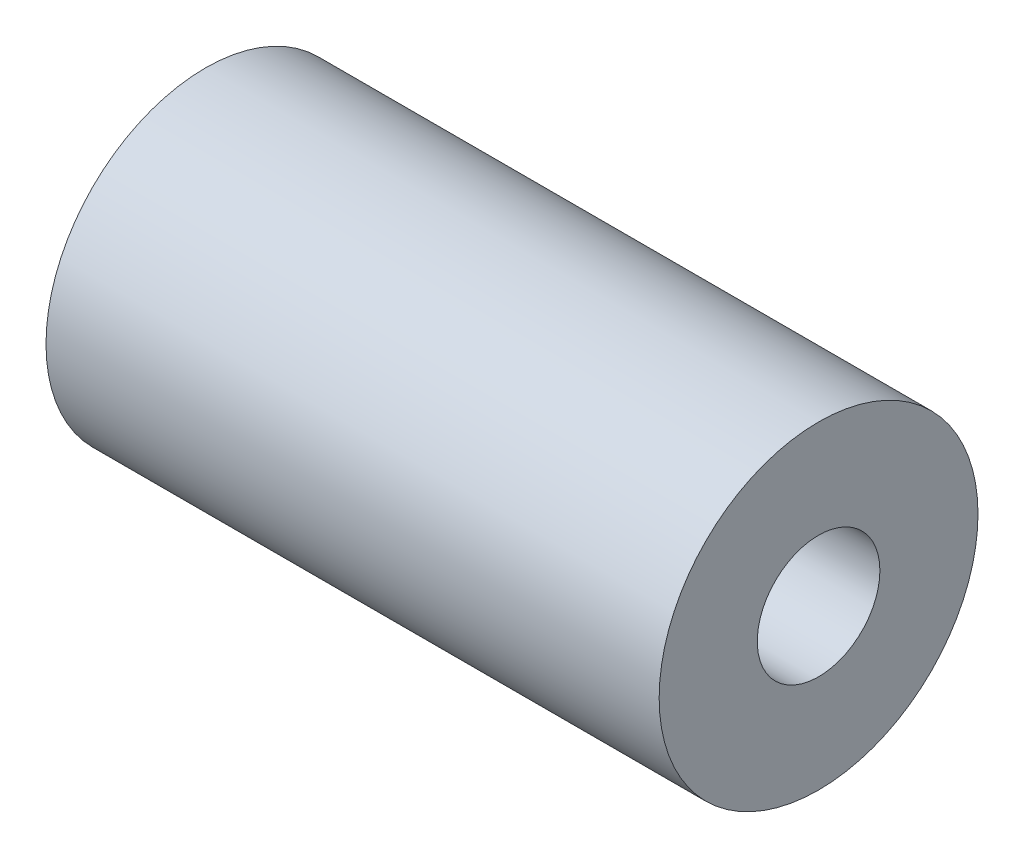
ISO-10303-21;
HEADER;
FILE_DESCRIPTION(('STEP AP214'),'2;1');
FILE_NAME('part.step','',(''),(''),'','','');
FILE_SCHEMA(('AUTOMOTIVE_DESIGN { 1 0 10303 214 1 1 1 1 }'));
ENDSEC;
DATA;
#1=APPLICATION_CONTEXT('core data for automotive mechanical design processes');
#2=APPLICATION_PROTOCOL_DEFINITION('international standard','automotive_design',2000,#1);
#3=PRODUCT_CONTEXT('',#1,'mechanical');
#4=PRODUCT('Part','Part','',(#3));
#5=PRODUCT_RELATED_PRODUCT_CATEGORY('part','',(#4));
#6=PRODUCT_DEFINITION_FORMATION('','',#4);
#7=PRODUCT_DEFINITION_CONTEXT('part definition',#1,'design');
#8=PRODUCT_DEFINITION('design','',#6,#7);
#9=PRODUCT_DEFINITION_SHAPE('','',#8);
#10=(LENGTH_UNIT() NAMED_UNIT(*) SI_UNIT(.MILLI.,.METRE.));
#11=(NAMED_UNIT(*) PLANE_ANGLE_UNIT() SI_UNIT($,.RADIAN.));
#12=(NAMED_UNIT(*) SI_UNIT($,.STERADIAN.) SOLID_ANGLE_UNIT());
#13=UNCERTAINTY_MEASURE_WITH_UNIT(LENGTH_MEASURE(1.E-05),#10,'distance_accuracy_value','');
#14=(GEOMETRIC_REPRESENTATION_CONTEXT(3) GLOBAL_UNCERTAINTY_ASSIGNED_CONTEXT((#13)) GLOBAL_UNIT_ASSIGNED_CONTEXT((#10,
#11,#12)) REPRESENTATION_CONTEXT('',''));
#15=CARTESIAN_POINT('',(0.,0.,0.));
#16=DIRECTION('',(0.,0.,1.));
#17=DIRECTION('',(1.,0.,0.));
#18=AXIS2_PLACEMENT_3D('',#15,#16,#17);
#19=CARTESIAN_POINT('',(12.5,0.,0.));
#20=DIRECTION('',(-1.,0.,0.));
#21=DIRECTION('',(0.,0.,1.));
#22=AXIS2_PLACEMENT_3D('',#19,#20,#21);
#23=CYLINDRICAL_SURFACE('',#22,6.5);
#24=CARTESIAN_POINT('',(12.5,0.,0.));
#25=DIRECTION('',(1.,0.,0.));
#26=DIRECTION('',(0.,0.,-1.));
#27=AXIS2_PLACEMENT_3D('',#24,#25,#26);
#28=CIRCLE('',#27,6.5);
#29=CARTESIAN_POINT('',(12.5,0.,-6.5));
#30=VERTEX_POINT('',#29);
#31=EDGE_CURVE('E10',#30,#30,#28,.T.);
#32=ORIENTED_EDGE('',*,*,#31,.F.);
#33=EDGE_LOOP('',(#32));
#34=FACE_BOUND('',#33,.T.);
#35=CARTESIAN_POINT('',(-12.5,0.,0.));
#36=DIRECTION('',(1.,0.,0.));
#37=DIRECTION('',(0.,0.,-1.));
#38=AXIS2_PLACEMENT_3D('',#35,#36,#37);
#39=CIRCLE('',#38,6.5);
#40=CARTESIAN_POINT('',(-12.5,0.,-6.5));
#41=VERTEX_POINT('',#40);
#42=EDGE_CURVE('E33',#41,#41,#39,.T.);
#43=ORIENTED_EDGE('',*,*,#42,.T.);
#44=EDGE_LOOP('',(#43));
#45=FACE_BOUND('',#44,.T.);
#46=ADVANCED_FACE('F30',(#34,#45),#23,.T.);
#47=CARTESIAN_POINT('',(12.5,0.,0.));
#48=DIRECTION('',(1.,0.,0.));
#49=DIRECTION('',(0.,0.,-1.));
#50=AXIS2_PLACEMENT_3D('',#47,#48,#49);
#51=PLANE('',#50);
#52=CARTESIAN_POINT('',(12.5,0.,0.));
#53=DIRECTION('',(1.,0.,0.));
#54=DIRECTION('',(0.,0.,-1.));
#55=AXIS2_PLACEMENT_3D('',#52,#53,#54);
#56=CIRCLE('',#55,2.5);
#57=CARTESIAN_POINT('',(12.5,0.,-2.5));
#58=VERTEX_POINT('',#57);
#59=EDGE_CURVE('E40',#58,#58,#56,.T.);
#60=ORIENTED_EDGE('',*,*,#59,.F.);
#61=EDGE_LOOP('',(#60));
#62=FACE_BOUND('',#61,.T.);
#63=ORIENTED_EDGE('',*,*,#31,.T.);
#64=EDGE_LOOP('',(#63));
#65=FACE_BOUND('',#64,.T.);
#66=ADVANCED_FACE('F67',(#62,#65),#51,.T.);
#67=CARTESIAN_POINT('',(-12.5,0.,0.));
#68=DIRECTION('',(1.,0.,0.));
#69=DIRECTION('',(0.,0.,-1.));
#70=AXIS2_PLACEMENT_3D('',#67,#68,#69);
#71=PLANE('',#70);
#72=CARTESIAN_POINT('',(-12.5,0.,0.));
#73=DIRECTION('',(-1.,0.,0.));
#74=DIRECTION('',(0.,0.,1.));
#75=AXIS2_PLACEMENT_3D('',#72,#73,#74);
#76=CIRCLE('',#75,4.);
#77=CARTESIAN_POINT('',(-12.5,0.,4.));
#78=VERTEX_POINT('',#77);
#79=EDGE_CURVE('E48',#78,#78,#76,.T.);
#80=ORIENTED_EDGE('',*,*,#79,.F.);
#81=EDGE_LOOP('',(#80));
#82=FACE_BOUND('',#81,.T.);
#83=ORIENTED_EDGE('',*,*,#42,.F.);
#84=EDGE_LOOP('',(#83));
#85=FACE_BOUND('',#84,.T.);
#86=ADVANCED_FACE('F63',(#82,#85),#71,.F.);
#87=CARTESIAN_POINT('',(0.,0.,0.));
#88=DIRECTION('',(1.,0.,0.));
#89=DIRECTION('',(0.,0.,-1.));
#90=AXIS2_PLACEMENT_3D('',#87,#88,#89);
#91=CYLINDRICAL_SURFACE('',#90,2.5);
#92=CARTESIAN_POINT('',(0.,0.,0.));
#93=DIRECTION('',(-1.,0.,0.));
#94=DIRECTION('',(0.,0.,1.));
#95=AXIS2_PLACEMENT_3D('',#92,#93,#94);
#96=CIRCLE('',#95,2.5);
#97=CARTESIAN_POINT('',(0.,0.,2.5));
#98=VERTEX_POINT('',#97);
#99=EDGE_CURVE('E44',#98,#98,#96,.F.);
#100=ORIENTED_EDGE('',*,*,#99,.F.);
#101=EDGE_LOOP('',(#100));
#102=FACE_BOUND('',#101,.T.);
#103=ORIENTED_EDGE('',*,*,#59,.T.);
#104=EDGE_LOOP('',(#103));
#105=FACE_BOUND('',#104,.T.);
#106=ADVANCED_FACE('F66',(#102,#105),#91,.F.);
#107=CARTESIAN_POINT('',(0.,0.,0.));
#108=DIRECTION('',(-1.,0.,0.));
#109=DIRECTION('',(0.,0.,1.));
#110=AXIS2_PLACEMENT_3D('',#107,#108,#109);
#111=PLANE('',#110);
#112=CARTESIAN_POINT('',(0.,0.,0.));
#113=DIRECTION('',(-1.,0.,0.));
#114=DIRECTION('',(0.,0.,1.));
#115=AXIS2_PLACEMENT_3D('',#112,#113,#114);
#116=CIRCLE('',#115,4.);
#117=CARTESIAN_POINT('',(0.,0.,4.));
#118=VERTEX_POINT('',#117);
#119=EDGE_CURVE('E47',#118,#118,#116,.T.);
#120=ORIENTED_EDGE('',*,*,#119,.T.);
#121=EDGE_LOOP('',(#120));
#122=FACE_BOUND('',#121,.T.);
#123=ORIENTED_EDGE('',*,*,#99,.T.);
#124=EDGE_LOOP('',(#123));
#125=FACE_BOUND('',#124,.T.);
#126=ADVANCED_FACE('F54',(#122,#125),#111,.T.);
#127=CARTESIAN_POINT('',(0.,0.,0.));
#128=DIRECTION('',(-1.,0.,0.));
#129=DIRECTION('',(0.,0.,1.));
#130=AXIS2_PLACEMENT_3D('',#127,#128,#129);
#131=CYLINDRICAL_SURFACE('',#130,4.);
#132=ORIENTED_EDGE('',*,*,#119,.F.);
#133=EDGE_LOOP('',(#132));
#134=FACE_BOUND('',#133,.T.);
#135=ORIENTED_EDGE('',*,*,#79,.T.);
#136=EDGE_LOOP('',(#135));
#137=FACE_BOUND('',#136,.T.);
#138=ADVANCED_FACE('F57',(#134,#137),#131,.F.);
#139=CLOSED_SHELL('',(#46,#66,#86,#106,#126,#138));
#140=MANIFOLD_SOLID_BREP('B2',#139);
#141=ADVANCED_BREP_SHAPE_REPRESENTATION('',(#18,#140),#14);
#142=SHAPE_DEFINITION_REPRESENTATION(#9,#141);
ENDSEC;
END-ISO-10303-21;
